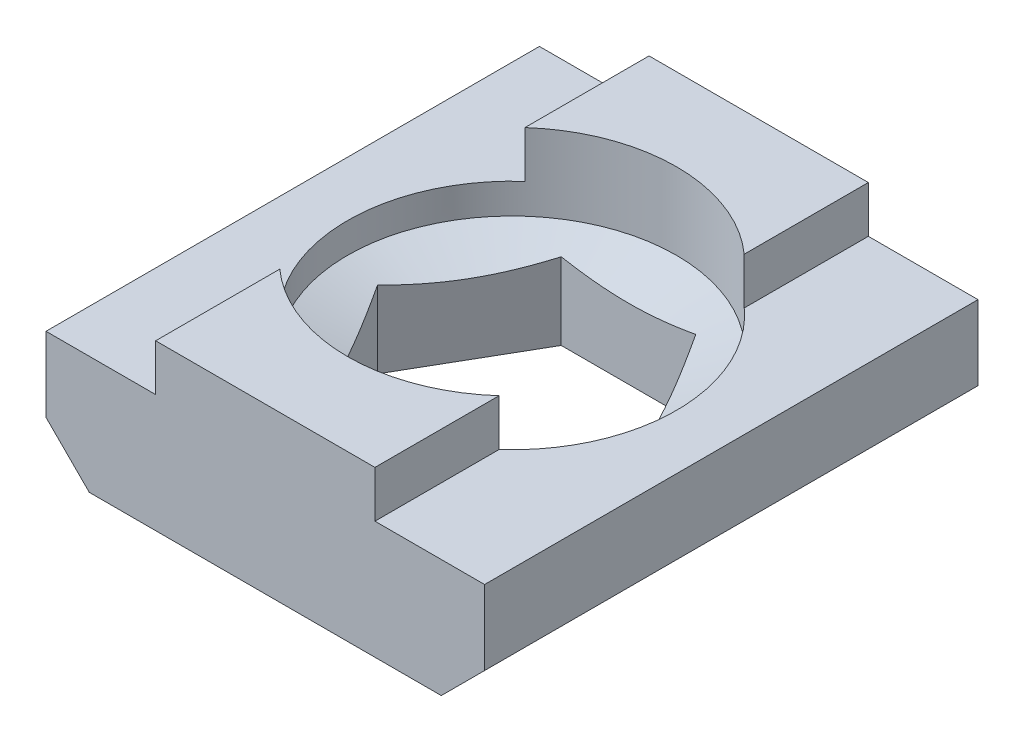
ISO-10303-21;
HEADER;
FILE_DESCRIPTION(('STEP AP214'),'2;1');
FILE_NAME('part.step','',(''),(''),'','','');
FILE_SCHEMA(('AUTOMOTIVE_DESIGN { 1 0 10303 214 1 1 1 1 }'));
ENDSEC;
DATA;
#1=APPLICATION_CONTEXT('core data for automotive mechanical design processes');
#2=APPLICATION_PROTOCOL_DEFINITION('international standard','automotive_design',2000,#1);
#3=PRODUCT_CONTEXT('',#1,'mechanical');
#4=PRODUCT('Part','Part','',(#3));
#5=PRODUCT_RELATED_PRODUCT_CATEGORY('part','',(#4));
#6=PRODUCT_DEFINITION_FORMATION('','',#4);
#7=PRODUCT_DEFINITION_CONTEXT('part definition',#1,'design');
#8=PRODUCT_DEFINITION('design','',#6,#7);
#9=PRODUCT_DEFINITION_SHAPE('','',#8);
#10=(LENGTH_UNIT() NAMED_UNIT(*) SI_UNIT(.MILLI.,.METRE.));
#11=(NAMED_UNIT(*) PLANE_ANGLE_UNIT() SI_UNIT($,.RADIAN.));
#12=(NAMED_UNIT(*) SI_UNIT($,.STERADIAN.) SOLID_ANGLE_UNIT());
#13=UNCERTAINTY_MEASURE_WITH_UNIT(LENGTH_MEASURE(1.E-05),#10,'distance_accuracy_value','');
#14=(GEOMETRIC_REPRESENTATION_CONTEXT(3) GLOBAL_UNCERTAINTY_ASSIGNED_CONTEXT((#13)) GLOBAL_UNIT_ASSIGNED_CONTEXT((#10,
#11,#12)) REPRESENTATION_CONTEXT('',''));
#15=CARTESIAN_POINT('',(0.,0.,0.));
#16=DIRECTION('',(0.,0.,1.));
#17=DIRECTION('',(1.,0.,0.));
#18=AXIS2_PLACEMENT_3D('',#15,#16,#17);
#19=CARTESIAN_POINT('',(4.,3.,9.));
#20=DIRECTION('',(0.,-1.,0.));
#21=DIRECTION('',(0.,0.,-1.));
#22=AXIS2_PLACEMENT_3D('',#19,#20,#21);
#23=PLANE('',#22);
#24=DIRECTION('',(0.,0.,1.));
#25=VECTOR('',#24,1.);
#26=CARTESIAN_POINT('',(4.,3.,9.));
#27=LINE('',#26,#25);
#28=CARTESIAN_POINT('',(4.,3.,4.47213595499958));
#29=VERTEX_POINT('',#28);
#30=CARTESIAN_POINT('',(4.,3.,9.));
#31=VERTEX_POINT('',#30);
#32=EDGE_CURVE('E273',#29,#31,#27,.T.);
#33=ORIENTED_EDGE('',*,*,#32,.F.);
#34=CARTESIAN_POINT('',(0.,3.,0.));
#35=DIRECTION('',(0.,1.,0.));
#36=DIRECTION('',(0.,0.,1.));
#37=AXIS2_PLACEMENT_3D('',#34,#35,#36);
#38=CIRCLE('',#37,6.);
#39=CARTESIAN_POINT('',(-4.,3.,4.47213595499958));
#40=VERTEX_POINT('',#39);
#41=EDGE_CURVE('E197',#40,#29,#38,.T.);
#42=ORIENTED_EDGE('',*,*,#41,.F.);
#43=DIRECTION('',(0.,0.,1.));
#44=VECTOR('',#43,1.);
#45=CARTESIAN_POINT('',(-4.,3.,9.));
#46=LINE('',#45,#44);
#47=CARTESIAN_POINT('',(-4.,3.,9.));
#48=VERTEX_POINT('',#47);
#49=EDGE_CURVE('E290',#40,#48,#46,.T.);
#50=ORIENTED_EDGE('',*,*,#49,.T.);
#51=DIRECTION('',(-1.,0.,0.));
#52=VECTOR('',#51,1.);
#53=CARTESIAN_POINT('',(4.,3.,9.));
#54=LINE('',#53,#52);
#55=EDGE_CURVE('E298',#31,#48,#54,.T.);
#56=ORIENTED_EDGE('',*,*,#55,.F.);
#57=EDGE_LOOP('',(#33,#42,#50,#56));
#58=FACE_BOUND('',#57,.T.);
#59=ADVANCED_FACE('F33',(#58),#23,.F.);
#60=CARTESIAN_POINT('',(4.,0.,0.));
#61=DIRECTION('',(1.,0.,0.));
#62=DIRECTION('',(0.,0.,-1.));
#63=AXIS2_PLACEMENT_3D('',#60,#61,#62);
#64=PLANE('',#63);
#65=DIRECTION('',(0.,1.,0.));
#66=VECTOR('',#65,1.);
#67=CARTESIAN_POINT('',(4.,1.,-4.47213595499958));
#68=LINE('',#67,#66);
#69=CARTESIAN_POINT('',(4.,1.3,-4.47213595499958));
#70=VERTEX_POINT('',#69);
#71=CARTESIAN_POINT('',(4.,3.,-4.47213595499958));
#72=VERTEX_POINT('',#71);
#73=EDGE_CURVE('E203',#70,#72,#68,.T.);
#74=ORIENTED_EDGE('',*,*,#73,.F.);
#75=DIRECTION('',(0.,0.,1.));
#76=VECTOR('',#75,1.);
#77=CARTESIAN_POINT('',(4.,1.3,-9.));
#78=LINE('',#77,#76);
#79=CARTESIAN_POINT('',(4.,1.3,-9.));
#80=VERTEX_POINT('',#79);
#81=EDGE_CURVE('E231',#80,#70,#78,.T.);
#82=ORIENTED_EDGE('',*,*,#81,.F.);
#83=DIRECTION('',(0.,1.,0.));
#84=VECTOR('',#83,1.);
#85=CARTESIAN_POINT('',(4.,3.,-9.));
#86=LINE('',#85,#84);
#87=CARTESIAN_POINT('',(4.,3.,-9.));
#88=VERTEX_POINT('',#87);
#89=EDGE_CURVE('E272',#80,#88,#86,.T.);
#90=ORIENTED_EDGE('',*,*,#89,.T.);
#91=EDGE_CURVE('E279',#88,#72,#27,.T.);
#92=ORIENTED_EDGE('',*,*,#91,.T.);
#93=EDGE_LOOP('',(#74,#82,#90,#92));
#94=FACE_BOUND('',#93,.T.);
#95=ADVANCED_FACE('F362',(#94),#64,.T.);
#96=CARTESIAN_POINT('',(-4.,0.,0.));
#97=DIRECTION('',(1.,0.,0.));
#98=DIRECTION('',(0.,0.,-1.));
#99=AXIS2_PLACEMENT_3D('',#96,#97,#98);
#100=PLANE('',#99);
#101=DIRECTION('',(0.,0.,1.));
#102=VECTOR('',#101,1.);
#103=CARTESIAN_POINT('',(-4.,1.3,-9.));
#104=LINE('',#103,#102);
#105=CARTESIAN_POINT('',(-4.,1.3,-9.));
#106=VERTEX_POINT('',#105);
#107=CARTESIAN_POINT('',(-4.,1.3,-4.47213595499958));
#108=VERTEX_POINT('',#107);
#109=EDGE_CURVE('E249',#106,#108,#104,.T.);
#110=ORIENTED_EDGE('',*,*,#109,.T.);
#111=DIRECTION('',(0.,1.,0.));
#112=VECTOR('',#111,1.);
#113=CARTESIAN_POINT('',(-4.,1.,-4.47213595499958));
#114=LINE('',#113,#112);
#115=CARTESIAN_POINT('',(-4.,3.,-4.47213595499958));
#116=VERTEX_POINT('',#115);
#117=EDGE_CURVE('E210',#108,#116,#114,.T.);
#118=ORIENTED_EDGE('',*,*,#117,.T.);
#119=CARTESIAN_POINT('',(-4.,3.,-9.));
#120=VERTEX_POINT('',#119);
#121=EDGE_CURVE('E284',#120,#116,#46,.T.);
#122=ORIENTED_EDGE('',*,*,#121,.F.);
#123=DIRECTION('',(0.,1.,0.));
#124=VECTOR('',#123,1.);
#125=CARTESIAN_POINT('',(-4.,3.,-9.));
#126=LINE('',#125,#124);
#127=EDGE_CURVE('E287',#106,#120,#126,.T.);
#128=ORIENTED_EDGE('',*,*,#127,.F.);
#129=EDGE_LOOP('',(#110,#118,#122,#128));
#130=FACE_BOUND('',#129,.T.);
#131=ADVANCED_FACE('F321',(#130),#100,.F.);
#132=CARTESIAN_POINT('',(4.,3.,-9.));
#133=DIRECTION('',(0.,0.,1.));
#134=DIRECTION('',(0.,-1.,0.));
#135=AXIS2_PLACEMENT_3D('',#132,#133,#134);
#136=PLANE('',#135);
#137=DIRECTION('',(-1.,0.,0.));
#138=VECTOR('',#137,1.);
#139=CARTESIAN_POINT('',(4.,-3.,-9.));
#140=LINE('',#139,#138);
#141=CARTESIAN_POINT('',(6.42,-3.,-9.));
#142=VERTEX_POINT('',#141);
#143=CARTESIAN_POINT('',(-6.42,-3.,-9.));
#144=VERTEX_POINT('',#143);
#145=EDGE_CURVE('E278',#142,#144,#140,.T.);
#146=ORIENTED_EDGE('',*,*,#145,.T.);
#147=DIRECTION('',(0.707106781186546,-0.707106781186549,0.));
#148=VECTOR('',#147,1.);
#149=CARTESIAN_POINT('',(-6.42,-3.,-9.));
#150=LINE('',#149,#148);
#151=CARTESIAN_POINT('',(-8.,-1.41999999999999,-9.));
#152=VERTEX_POINT('',#151);
#153=EDGE_CURVE('E250',#152,#144,#150,.T.);
#154=ORIENTED_EDGE('',*,*,#153,.F.);
#155=DIRECTION('',(0.,-1.,0.));
#156=VECTOR('',#155,1.);
#157=CARTESIAN_POINT('',(-8.,-1.41999999999999,-9.));
#158=LINE('',#157,#156);
#159=CARTESIAN_POINT('',(-8.,1.3,-9.));
#160=VERTEX_POINT('',#159);
#161=EDGE_CURVE('E268',#160,#152,#158,.T.);
#162=ORIENTED_EDGE('',*,*,#161,.F.);
#163=DIRECTION('',(-1.,0.,0.));
#164=VECTOR('',#163,1.);
#165=CARTESIAN_POINT('',(-4.,1.3,-9.));
#166=LINE('',#165,#164);
#167=EDGE_CURVE('E265',#106,#160,#166,.T.);
#168=ORIENTED_EDGE('',*,*,#167,.F.);
#169=ORIENTED_EDGE('',*,*,#127,.T.);
#170=DIRECTION('',(-1.,0.,0.));
#171=VECTOR('',#170,1.);
#172=CARTESIAN_POINT('',(4.,3.,-9.));
#173=LINE('',#172,#171);
#174=EDGE_CURVE('E246',#88,#120,#173,.T.);
#175=ORIENTED_EDGE('',*,*,#174,.F.);
#176=ORIENTED_EDGE('',*,*,#89,.F.);
#177=DIRECTION('',(-1.,0.,0.));
#178=VECTOR('',#177,1.);
#179=CARTESIAN_POINT('',(4.,1.3,-9.));
#180=LINE('',#179,#178);
#181=CARTESIAN_POINT('',(8.,1.3,-9.));
#182=VERTEX_POINT('',#181);
#183=EDGE_CURVE('E221',#182,#80,#180,.T.);
#184=ORIENTED_EDGE('',*,*,#183,.F.);
#185=DIRECTION('',(0.,1.,0.));
#186=VECTOR('',#185,1.);
#187=CARTESIAN_POINT('',(8.,-1.41999999999999,-9.));
#188=LINE('',#187,#186);
#189=CARTESIAN_POINT('',(8.,-1.41999999999999,-9.));
#190=VERTEX_POINT('',#189);
#191=EDGE_CURVE('E217',#190,#182,#188,.T.);
#192=ORIENTED_EDGE('',*,*,#191,.F.);
#193=DIRECTION('',(0.707106781186546,0.707106781186549,0.));
#194=VECTOR('',#193,1.);
#195=CARTESIAN_POINT('',(6.42,-3.,-9.));
#196=LINE('',#195,#194);
#197=EDGE_CURVE('E214',#142,#190,#196,.T.);
#198=ORIENTED_EDGE('',*,*,#197,.F.);
#199=EDGE_LOOP('',(#146,#154,#162,#168,#169,#175,#176,#184,#192,#198));
#200=FACE_BOUND('',#199,.T.);
#201=ADVANCED_FACE('F35',(#200),#136,.F.);
#202=ORIENTED_EDGE('',*,*,#121,.T.);
#203=EDGE_CURVE('E199',#72,#116,#38,.T.);
#204=ORIENTED_EDGE('',*,*,#203,.F.);
#205=ORIENTED_EDGE('',*,*,#91,.F.);
#206=ORIENTED_EDGE('',*,*,#174,.T.);
#207=EDGE_LOOP('',(#202,#204,#205,#206));
#208=FACE_BOUND('',#207,.T.);
#209=ADVANCED_FACE('F309',(#208),#23,.F.);
#210=CARTESIAN_POINT('',(4.,3.,9.));
#211=DIRECTION('',(0.,0.,-1.));
#212=DIRECTION('',(0.,1.,0.));
#213=AXIS2_PLACEMENT_3D('',#210,#211,#212);
#214=PLANE('',#213);
#215=DIRECTION('',(0.,-1.,0.));
#216=VECTOR('',#215,1.);
#217=CARTESIAN_POINT('',(-4.,3.,9.));
#218=LINE('',#217,#216);
#219=CARTESIAN_POINT('',(-4.,1.3,9.));
#220=VERTEX_POINT('',#219);
#221=EDGE_CURVE('E274',#48,#220,#218,.T.);
#222=ORIENTED_EDGE('',*,*,#221,.T.);
#223=DIRECTION('',(-1.,0.,0.));
#224=VECTOR('',#223,1.);
#225=CARTESIAN_POINT('',(-4.,1.3,9.));
#226=LINE('',#225,#224);
#227=CARTESIAN_POINT('',(-8.,1.3,9.));
#228=VERTEX_POINT('',#227);
#229=EDGE_CURVE('E230',#220,#228,#226,.T.);
#230=ORIENTED_EDGE('',*,*,#229,.T.);
#231=DIRECTION('',(0.,-1.,0.));
#232=VECTOR('',#231,1.);
#233=CARTESIAN_POINT('',(-8.,-1.41999999999999,9.));
#234=LINE('',#233,#232);
#235=CARTESIAN_POINT('',(-8.,-1.41999999999999,9.));
#236=VERTEX_POINT('',#235);
#237=EDGE_CURVE('E335',#228,#236,#234,.T.);
#238=ORIENTED_EDGE('',*,*,#237,.T.);
#239=DIRECTION('',(0.707106781186546,-0.707106781186549,0.));
#240=VECTOR('',#239,1.);
#241=CARTESIAN_POINT('',(-6.42,-3.,9.));
#242=LINE('',#241,#240);
#243=CARTESIAN_POINT('',(-6.42,-3.,9.));
#244=VERTEX_POINT('',#243);
#245=EDGE_CURVE('E269',#236,#244,#242,.T.);
#246=ORIENTED_EDGE('',*,*,#245,.T.);
#247=DIRECTION('',(-1.,0.,0.));
#248=VECTOR('',#247,1.);
#249=CARTESIAN_POINT('',(4.,-3.,9.));
#250=LINE('',#249,#248);
#251=CARTESIAN_POINT('',(6.42,-3.,9.));
#252=VERTEX_POINT('',#251);
#253=EDGE_CURVE('E297',#252,#244,#250,.T.);
#254=ORIENTED_EDGE('',*,*,#253,.F.);
#255=DIRECTION('',(0.707106781186546,0.707106781186549,0.));
#256=VECTOR('',#255,1.);
#257=CARTESIAN_POINT('',(6.42,-3.,9.));
#258=LINE('',#257,#256);
#259=CARTESIAN_POINT('',(8.,-1.41999999999999,9.));
#260=VERTEX_POINT('',#259);
#261=EDGE_CURVE('E213',#252,#260,#258,.T.);
#262=ORIENTED_EDGE('',*,*,#261,.T.);
#263=DIRECTION('',(0.,1.,0.));
#264=VECTOR('',#263,1.);
#265=CARTESIAN_POINT('',(8.,-1.41999999999999,9.));
#266=LINE('',#265,#264);
#267=CARTESIAN_POINT('',(8.,1.3,9.));
#268=VERTEX_POINT('',#267);
#269=EDGE_CURVE('E224',#260,#268,#266,.T.);
#270=ORIENTED_EDGE('',*,*,#269,.T.);
#271=DIRECTION('',(-1.,0.,0.));
#272=VECTOR('',#271,1.);
#273=CARTESIAN_POINT('',(4.,1.3,9.));
#274=LINE('',#273,#272);
#275=CARTESIAN_POINT('',(4.,1.3,9.));
#276=VERTEX_POINT('',#275);
#277=EDGE_CURVE('E218',#268,#276,#274,.T.);
#278=ORIENTED_EDGE('',*,*,#277,.T.);
#279=DIRECTION('',(0.,-1.,0.));
#280=VECTOR('',#279,1.);
#281=CARTESIAN_POINT('',(4.,3.,9.));
#282=LINE('',#281,#280);
#283=EDGE_CURVE('E275',#31,#276,#282,.T.);
#284=ORIENTED_EDGE('',*,*,#283,.F.);
#285=ORIENTED_EDGE('',*,*,#55,.T.);
#286=EDGE_LOOP('',(#222,#230,#238,#246,#254,#262,#270,#278,#284,#285));
#287=FACE_BOUND('',#286,.T.);
#288=ADVANCED_FACE('F331',(#287),#214,.F.);
#289=CARTESIAN_POINT('',(4.,-3.,9.));
#290=DIRECTION('',(0.,1.,0.));
#291=DIRECTION('',(0.,0.,1.));
#292=AXIS2_PLACEMENT_3D('',#289,#290,#291);
#293=PLANE('',#292);
#294=DIRECTION('',(-0.5,0.,-0.866025403784439));
#295=VECTOR('',#294,1.);
#296=CARTESIAN_POINT('',(-2.45373864405591,-3.,4.25));
#297=LINE('',#296,#295);
#298=CARTESIAN_POINT('',(-2.45373864405591,-3.,4.25));
#299=VERTEX_POINT('',#298);
#300=CARTESIAN_POINT('',(-4.90747728811182,-3.,0.));
#301=VERTEX_POINT('',#300);
#302=EDGE_CURVE('E188',#299,#301,#297,.T.);
#303=ORIENTED_EDGE('',*,*,#302,.F.);
#304=DIRECTION('',(-1.,0.,0.));
#305=VECTOR('',#304,1.);
#306=CARTESIAN_POINT('',(2.45373864405591,-3.,4.25));
#307=LINE('',#306,#305);
#308=CARTESIAN_POINT('',(2.45373864405591,-3.,4.25));
#309=VERTEX_POINT('',#308);
#310=EDGE_CURVE('E445',#309,#299,#307,.T.);
#311=ORIENTED_EDGE('',*,*,#310,.F.);
#312=DIRECTION('',(-0.5,0.,0.866025403784439));
#313=VECTOR('',#312,1.);
#314=CARTESIAN_POINT('',(4.90747728811182,-3.,0.));
#315=LINE('',#314,#313);
#316=CARTESIAN_POINT('',(4.90747728811182,-3.,0.));
#317=VERTEX_POINT('',#316);
#318=EDGE_CURVE('E193',#317,#309,#315,.T.);
#319=ORIENTED_EDGE('',*,*,#318,.F.);
#320=DIRECTION('',(0.5,0.,0.866025403784439));
#321=VECTOR('',#320,1.);
#322=CARTESIAN_POINT('',(2.45373864405591,-3.,-4.25));
#323=LINE('',#322,#321);
#324=CARTESIAN_POINT('',(2.45373864405591,-3.,-4.25));
#325=VERTEX_POINT('',#324);
#326=EDGE_CURVE('E645',#325,#317,#323,.T.);
#327=ORIENTED_EDGE('',*,*,#326,.F.);
#328=DIRECTION('',(1.,0.,0.));
#329=VECTOR('',#328,1.);
#330=CARTESIAN_POINT('',(-2.45373864405591,-3.,-4.25));
#331=LINE('',#330,#329);
#332=CARTESIAN_POINT('',(-2.45373864405591,-3.,-4.25));
#333=VERTEX_POINT('',#332);
#334=EDGE_CURVE('E647',#333,#325,#331,.T.);
#335=ORIENTED_EDGE('',*,*,#334,.F.);
#336=DIRECTION('',(0.5,0.,-0.866025403784439));
#337=VECTOR('',#336,1.);
#338=CARTESIAN_POINT('',(-4.90747728811182,-3.,0.));
#339=LINE('',#338,#337);
#340=EDGE_CURVE('E648',#301,#333,#339,.T.);
#341=ORIENTED_EDGE('',*,*,#340,.F.);
#342=EDGE_LOOP('',(#303,#311,#319,#327,#335,#341));
#343=FACE_BOUND('',#342,.T.);
#344=ORIENTED_EDGE('',*,*,#253,.T.);
#345=DIRECTION('',(0.,0.,1.));
#346=VECTOR('',#345,1.);
#347=CARTESIAN_POINT('',(-6.42,-3.,-9.));
#348=LINE('',#347,#346);
#349=EDGE_CURVE('E291',#144,#244,#348,.T.);
#350=ORIENTED_EDGE('',*,*,#349,.F.);
#351=ORIENTED_EDGE('',*,*,#145,.F.);
#352=DIRECTION('',(0.,0.,1.));
#353=VECTOR('',#352,1.);
#354=CARTESIAN_POINT('',(6.42,-3.,-9.));
#355=LINE('',#354,#353);
#356=EDGE_CURVE('E227',#142,#252,#355,.T.);
#357=ORIENTED_EDGE('',*,*,#356,.T.);
#358=EDGE_LOOP('',(#344,#350,#351,#357));
#359=FACE_BOUND('',#358,.T.);
#360=ADVANCED_FACE('F377',(#343,#359),#293,.F.);
#361=DIRECTION('',(0.,1.,0.));
#362=VECTOR('',#361,1.);
#363=CARTESIAN_POINT('',(4.,1.,4.47213595499958));
#364=LINE('',#363,#362);
#365=CARTESIAN_POINT('',(4.,1.3,4.47213595499958));
#366=VERTEX_POINT('',#365);
#367=EDGE_CURVE('E201',#29,#366,#364,.F.);
#368=ORIENTED_EDGE('',*,*,#367,.F.);
#369=ORIENTED_EDGE('',*,*,#32,.T.);
#370=ORIENTED_EDGE('',*,*,#283,.T.);
#371=EDGE_CURVE('E241',#366,#276,#78,.T.);
#372=ORIENTED_EDGE('',*,*,#371,.F.);
#373=EDGE_LOOP('',(#368,#369,#370,#372));
#374=FACE_BOUND('',#373,.T.);
#375=ADVANCED_FACE('F369',(#374),#64,.T.);
#376=ORIENTED_EDGE('',*,*,#49,.F.);
#377=DIRECTION('',(0.,1.,0.));
#378=VECTOR('',#377,1.);
#379=CARTESIAN_POINT('',(-4.,1.,4.47213595499958));
#380=LINE('',#379,#378);
#381=CARTESIAN_POINT('',(-4.,1.3,4.47213595499958));
#382=VERTEX_POINT('',#381);
#383=EDGE_CURVE('E207',#40,#382,#380,.F.);
#384=ORIENTED_EDGE('',*,*,#383,.T.);
#385=EDGE_CURVE('E247',#382,#220,#104,.T.);
#386=ORIENTED_EDGE('',*,*,#385,.T.);
#387=ORIENTED_EDGE('',*,*,#221,.F.);
#388=EDGE_LOOP('',(#376,#384,#386,#387));
#389=FACE_BOUND('',#388,.T.);
#390=ADVANCED_FACE('F327',(#389),#100,.F.);
#391=CARTESIAN_POINT('',(-6.42,-3.,-9.));
#392=DIRECTION('',(-0.707106781186549,-0.707106781186546,0.));
#393=DIRECTION('',(0.707106781186546,-0.707106781186549,0.));
#394=AXIS2_PLACEMENT_3D('',#391,#392,#393);
#395=PLANE('',#394);
#396=ORIENTED_EDGE('',*,*,#245,.F.);
#397=DIRECTION('',(0.,0.,1.));
#398=VECTOR('',#397,1.);
#399=CARTESIAN_POINT('',(-8.,-1.41999999999999,-9.));
#400=LINE('',#399,#398);
#401=EDGE_CURVE('E344',#152,#236,#400,.T.);
#402=ORIENTED_EDGE('',*,*,#401,.F.);
#403=ORIENTED_EDGE('',*,*,#153,.T.);
#404=ORIENTED_EDGE('',*,*,#349,.T.);
#405=EDGE_LOOP('',(#396,#402,#403,#404));
#406=FACE_BOUND('',#405,.T.);
#407=ADVANCED_FACE('F351',(#406),#395,.T.);
#408=CARTESIAN_POINT('',(-8.,-1.41999999999999,-9.));
#409=DIRECTION('',(-1.,0.,0.));
#410=DIRECTION('',(0.,0.,1.));
#411=AXIS2_PLACEMENT_3D('',#408,#409,#410);
#412=PLANE('',#411);
#413=ORIENTED_EDGE('',*,*,#237,.F.);
#414=DIRECTION('',(0.,0.,1.));
#415=VECTOR('',#414,1.);
#416=CARTESIAN_POINT('',(-8.,1.3,-9.));
#417=LINE('',#416,#415);
#418=EDGE_CURVE('E254',#160,#228,#417,.T.);
#419=ORIENTED_EDGE('',*,*,#418,.F.);
#420=ORIENTED_EDGE('',*,*,#161,.T.);
#421=ORIENTED_EDGE('',*,*,#401,.T.);
#422=EDGE_LOOP('',(#413,#419,#420,#421));
#423=FACE_BOUND('',#422,.T.);
#424=ADVANCED_FACE('F349',(#423),#412,.T.);
#425=CARTESIAN_POINT('',(-4.,1.3,-9.));
#426=DIRECTION('',(0.,1.,0.));
#427=DIRECTION('',(-1.,0.,0.));
#428=AXIS2_PLACEMENT_3D('',#425,#426,#427);
#429=PLANE('',#428);
#430=CARTESIAN_POINT('',(0.,1.3,0.));
#431=DIRECTION('',(0.,1.,0.));
#432=DIRECTION('',(-1.,0.,0.));
#433=AXIS2_PLACEMENT_3D('',#430,#431,#432);
#434=CIRCLE('',#433,6.);
#435=EDGE_CURVE('E205',#108,#382,#434,.T.);
#436=ORIENTED_EDGE('',*,*,#435,.F.);
#437=ORIENTED_EDGE('',*,*,#109,.F.);
#438=ORIENTED_EDGE('',*,*,#167,.T.);
#439=ORIENTED_EDGE('',*,*,#418,.T.);
#440=ORIENTED_EDGE('',*,*,#229,.F.);
#441=ORIENTED_EDGE('',*,*,#385,.F.);
#442=EDGE_LOOP('',(#436,#437,#438,#439,#440,#441));
#443=FACE_BOUND('',#442,.T.);
#444=ADVANCED_FACE('F348',(#443),#429,.T.);
#445=CARTESIAN_POINT('',(6.42,-3.,-9.));
#446=DIRECTION('',(0.707106781186549,-0.707106781186546,0.));
#447=DIRECTION('',(0.707106781186546,0.707106781186549,0.));
#448=AXIS2_PLACEMENT_3D('',#445,#446,#447);
#449=PLANE('',#448);
#450=ORIENTED_EDGE('',*,*,#261,.F.);
#451=ORIENTED_EDGE('',*,*,#356,.F.);
#452=ORIENTED_EDGE('',*,*,#197,.T.);
#453=DIRECTION('',(0.,0.,1.));
#454=VECTOR('',#453,1.);
#455=CARTESIAN_POINT('',(8.,-1.41999999999999,-9.));
#456=LINE('',#455,#454);
#457=EDGE_CURVE('E405',#190,#260,#456,.T.);
#458=ORIENTED_EDGE('',*,*,#457,.T.);
#459=EDGE_LOOP('',(#450,#451,#452,#458));
#460=FACE_BOUND('',#459,.T.);
#461=ADVANCED_FACE('F357',(#460),#449,.T.);
#462=CARTESIAN_POINT('',(4.,1.3,-9.));
#463=DIRECTION('',(0.,1.,0.));
#464=DIRECTION('',(-1.,0.,0.));
#465=AXIS2_PLACEMENT_3D('',#462,#463,#464);
#466=PLANE('',#465);
#467=CARTESIAN_POINT('',(0.,1.3,0.));
#468=DIRECTION('',(0.,1.,0.));
#469=DIRECTION('',(-1.,0.,0.));
#470=AXIS2_PLACEMENT_3D('',#467,#468,#469);
#471=CIRCLE('',#470,6.);
#472=EDGE_CURVE('E46',#366,#70,#471,.T.);
#473=ORIENTED_EDGE('',*,*,#472,.F.);
#474=ORIENTED_EDGE('',*,*,#371,.T.);
#475=ORIENTED_EDGE('',*,*,#277,.F.);
#476=DIRECTION('',(0.,0.,1.));
#477=VECTOR('',#476,1.);
#478=CARTESIAN_POINT('',(8.,1.3,-9.));
#479=LINE('',#478,#477);
#480=EDGE_CURVE('E234',#182,#268,#479,.T.);
#481=ORIENTED_EDGE('',*,*,#480,.F.);
#482=ORIENTED_EDGE('',*,*,#183,.T.);
#483=ORIENTED_EDGE('',*,*,#81,.T.);
#484=EDGE_LOOP('',(#473,#474,#475,#481,#482,#483));
#485=FACE_BOUND('',#484,.T.);
#486=ADVANCED_FACE('F402',(#485),#466,.T.);
#487=CARTESIAN_POINT('',(8.,-1.41999999999999,-9.));
#488=DIRECTION('',(1.,0.,0.));
#489=DIRECTION('',(0.,0.,-1.));
#490=AXIS2_PLACEMENT_3D('',#487,#488,#489);
#491=PLANE('',#490);
#492=ORIENTED_EDGE('',*,*,#269,.F.);
#493=ORIENTED_EDGE('',*,*,#457,.F.);
#494=ORIENTED_EDGE('',*,*,#191,.T.);
#495=ORIENTED_EDGE('',*,*,#480,.T.);
#496=EDGE_LOOP('',(#492,#493,#494,#495));
#497=FACE_BOUND('',#496,.T.);
#498=ADVANCED_FACE('F412',(#497),#491,.T.);
#499=CARTESIAN_POINT('',(0.,1.,0.));
#500=DIRECTION('',(0.,1.,0.));
#501=DIRECTION('',(0.,0.,1.));
#502=AXIS2_PLACEMENT_3D('',#499,#500,#501);
#503=CYLINDRICAL_SURFACE('',#502,6.);
#504=ORIENTED_EDGE('',*,*,#435,.T.);
#505=ORIENTED_EDGE('',*,*,#383,.F.);
#506=ORIENTED_EDGE('',*,*,#41,.T.);
#507=ORIENTED_EDGE('',*,*,#367,.T.);
#508=ORIENTED_EDGE('',*,*,#472,.T.);
#509=ORIENTED_EDGE('',*,*,#73,.T.);
#510=ORIENTED_EDGE('',*,*,#203,.T.);
#511=ORIENTED_EDGE('',*,*,#117,.F.);
#512=EDGE_LOOP('',(#504,#505,#506,#507,#508,#509,#510,#511));
#513=FACE_BOUND('',#512,.T.);
#514=CARTESIAN_POINT('',(0.,0.200000000000001,0.));
#515=DIRECTION('',(0.,-1.,0.));
#516=DIRECTION('',(0.,0.,-1.));
#517=AXIS2_PLACEMENT_3D('',#514,#515,#516);
#518=CIRCLE('',#517,6.);
#519=CARTESIAN_POINT('',(0.,0.200000000000001,-6.));
#520=VERTEX_POINT('',#519);
#521=EDGE_CURVE('E184',#520,#520,#518,.T.);
#522=ORIENTED_EDGE('',*,*,#521,.T.);
#523=EDGE_LOOP('',(#522));
#524=FACE_BOUND('',#523,.T.);
#525=ADVANCED_FACE('F428',(#513,#524),#503,.F.);
#526=CARTESIAN_POINT('',(2.45373864405591,3.000025,4.25));
#527=DIRECTION('',(0.,0.,1.));
#528=DIRECTION('',(1.,0.,0.));
#529=AXIS2_PLACEMENT_3D('',#526,#527,#528);
#530=PLANE('',#529);
#531=DIRECTION('',(0.,-1.,0.));
#532=VECTOR('',#531,1.);
#533=CARTESIAN_POINT('',(-2.45373864405591,3.000025,4.25));
#534=LINE('',#533,#532);
#535=CARTESIAN_POINT('',(-2.45373864405591,-0.197645747387084,4.25));
#536=VERTEX_POINT('',#535);
#537=EDGE_CURVE('E59',#536,#299,#534,.T.);
#538=ORIENTED_EDGE('',*,*,#537,.F.);
#539=CARTESIAN_POINT('',(-6.51436184154452,0.847188823738504,4.25));
#540=CARTESIAN_POINT('',(-6.32185392453019,0.788522368236173,4.25));
#541=CARTESIAN_POINT('',(-6.12913470732467,0.730536681694376,4.25));
#542=CARTESIAN_POINT('',(-5.74316602338794,0.616303495409457,4.25));
#543=CARTESIAN_POINT('',(-5.5499165163478,0.560056132023769,4.25));
#544=CARTESIAN_POINT('',(-5.1624543620528,0.449584228118926,4.25));
#545=CARTESIAN_POINT('',(-4.96824059793102,0.395363590802965,4.25));
#546=CARTESIAN_POINT('',(-4.57909290971289,0.289575105302536,4.25));
#547=CARTESIAN_POINT('',(-4.38415899851191,0.23800720986091,4.25));
#548=CARTESIAN_POINT('',(-3.99589168640154,0.138807714990011,4.25));
#549=CARTESIAN_POINT('',(-3.80256887947181,0.0911348549377696,4.25));
#550=CARTESIAN_POINT('',(-3.41497312933515,-0.000176401972228466,4.25));
#551=CARTESIAN_POINT('',(-3.22070021825775,-0.0438149342784774,4.25));
#552=CARTESIAN_POINT('',(-2.83114168825223,-0.126050227351096,4.25));
#553=CARTESIAN_POINT('',(-2.63585638875951,-0.164648488451173,4.25));
#554=CARTESIAN_POINT('',(-2.24415132855499,-0.235631551406893,4.25));
#555=CARTESIAN_POINT('',(-2.0477316055948,-0.268016558815259,4.25));
#556=CARTESIAN_POINT('',(-1.67582437183872,-0.322059821473952,4.25));
#557=CARTESIAN_POINT('',(-1.50045343101238,-0.344512796157686,4.25));
#558=CARTESIAN_POINT('',(-1.1489744338244,-0.382579170322766,4.25));
#559=CARTESIAN_POINT('',(-0.972866441067907,-0.398193148182443,4.25));
#560=CARTESIAN_POINT('',(-0.620257720399248,-0.421832119906658,4.25));
#561=CARTESIAN_POINT('',(-0.44375735481892,-0.429862431710971,4.25));
#562=CARTESIAN_POINT('',(-0.0905721111476933,-0.437926685442383,4.25));
#563=CARTESIAN_POINT('',(0.0861127655537268,-0.437960687158347,4.25));
#564=CARTESIAN_POINT('',(0.440232194200711,-0.430009418736151,4.25));
#565=CARTESIAN_POINT('',(0.617665779812646,-0.42198181360387,4.25));
#566=CARTESIAN_POINT('',(0.972016565843205,-0.398273986316361,4.25));
#567=CARTESIAN_POINT('',(1.14893375358062,-0.382593577795143,4.25));
#568=CARTESIAN_POINT('',(1.50216453325804,-0.344317415975948,4.25));
#569=CARTESIAN_POINT('',(1.67847745995481,-0.321715611355691,4.25));
#570=CARTESIAN_POINT('',(2.0302205676042,-0.270518953493557,4.25));
#571=CARTESIAN_POINT('',(2.20565074591162,-0.241924082304049,4.25));
#572=CARTESIAN_POINT('',(2.57156965992484,-0.176838392499482,4.25));
#573=CARTESIAN_POINT('',(2.76197187101366,-0.139865183407493,4.25));
#574=CARTESIAN_POINT('',(3.14176365338498,-0.0610093667274228,4.25));
#575=CARTESIAN_POINT('',(3.33115313786311,-0.0191263451374171,4.25));
#576=CARTESIAN_POINT('',(3.7090626449337,0.0686109600643328,4.25));
#577=CARTESIAN_POINT('',(3.8975823967446,0.11446640273569,4.25));
#578=CARTESIAN_POINT('',(4.2738184192108,0.209372914279168,4.25));
#579=CARTESIAN_POINT('',(4.46153466078027,0.258424097806956,4.25));
#580=CARTESIAN_POINT('',(5.02416262645897,0.409548051894105,4.25));
#581=CARTESIAN_POINT('',(5.39803910193005,0.51546798068569,4.25));
#582=CARTESIAN_POINT('',(6.14372537133292,0.734022943177978,4.25));
#583=CARTESIAN_POINT('',(6.51553551854874,0.846656787798189,4.25));
#584=CARTESIAN_POINT('',(7.25330763539582,1.07517332658107,4.25));
#585=CARTESIAN_POINT('',(7.61928656487585,1.19100144607297,4.25));
#586=CARTESIAN_POINT('',(8.35023499097926,1.42585411280437,4.25));
#587=CARTESIAN_POINT('',(8.715204432742,1.5448788301396,4.25));
#588=CARTESIAN_POINT('',(9.44290955617929,1.78476027489914,4.25));
#589=CARTESIAN_POINT('',(9.80564831398259,1.90560769220574,4.25));
#590=CARTESIAN_POINT('',(10.5305058059089,2.14904619025833,4.25));
#591=CARTESIAN_POINT('',(10.8926245909811,2.27163711917403,4.25));
#592=CARTESIAN_POINT('',(11.2545343032014,2.39483343118178,4.25));
#593=B_SPLINE_CURVE_WITH_KNOTS('',3,(#539,#540,#541,#542,#543,#544,#545,#546,#547,#548,#549,
#550,#551,#552,#553,#554,#555,#556,#557,#558,#559,#560,#561,#562,#563,#564,#565,#566,#567,#568,
#569,#570,#571,#572,#573,#574,#575,#576,#577,#578,#579,#580,#581,#582,#583,#584,#585,#586,#587,
#588,#589,#590,#591,#592),.UNSPECIFIED.,.F.,.F.,(4,2,2,2,2,2,2,2,2,2,2,2,2,2,2,2,2,2,2,2,2,2,2,
2,2,2,4),(0.,0.603750426485387,1.20754809273279,1.81245424926815,2.41734962599393,
3.01465764514095,3.61194560298411,4.20905535930361,4.80614535806677,5.33643672043176,
5.86668322705431,6.39655762902802,6.92642806910059,7.45909571573821,7.99177633488832,
8.52492400861707,9.05807327900324,9.63986888728399,10.22171358868,10.8037286342729,
11.3857645727085,12.5514229584146,13.7168755079111,14.8684663897626,16.0201186713639,
17.167132249953,18.3140465473872),.UNSPECIFIED.);
#594=CARTESIAN_POINT('',(2.45373864405591,-0.197645747387084,4.25));
#595=VERTEX_POINT('',#594);
#596=EDGE_CURVE('E53',#536,#595,#593,.T.);
#597=ORIENTED_EDGE('',*,*,#596,.T.);
#598=DIRECTION('',(0.,-1.,0.));
#599=VECTOR('',#598,1.);
#600=CARTESIAN_POINT('',(2.45373864405591,3.000025,4.25));
#601=LINE('',#600,#599);
#602=EDGE_CURVE('E200',#595,#309,#601,.T.);
#603=ORIENTED_EDGE('',*,*,#602,.T.);
#604=ORIENTED_EDGE('',*,*,#310,.T.);
#605=EDGE_LOOP('',(#538,#597,#603,#604));
#606=FACE_BOUND('',#605,.T.);
#607=ADVANCED_FACE('F432',(#606),#530,.F.);
#608=CARTESIAN_POINT('',(4.90747728811182,3.000025,0.));
#609=DIRECTION('',(0.866025403784439,0.,0.5));
#610=DIRECTION('',(0.5,0.,-0.866025403784439));
#611=AXIS2_PLACEMENT_3D('',#608,#609,#610);
#612=PLANE('',#611);
#613=ORIENTED_EDGE('',*,*,#602,.F.);
#614=CARTESIAN_POINT('',(2.45362317400207,-0.197603718241244,4.2502));
#615=CARTESIAN_POINT('',(2.55524739097648,-0.234606674923836,4.07418169292092));
#616=CARTESIAN_POINT('',(2.65720673272343,-0.268267339050109,3.89758293270893));
#617=CARTESIAN_POINT('',(2.86178840252829,-0.327488156709816,3.54323708630963));
#618=CARTESIAN_POINT('',(2.96441118572057,-0.353041970765523,3.36548921180647));
#619=CARTESIAN_POINT('',(3.16918079656847,-0.394374564254043,3.0108178419718));
#620=CARTESIAN_POINT('',(3.2713229472077,-0.410243501262065,2.8339024474703));
#621=CARTESIAN_POINT('',(3.47584612326901,-0.431528214060303,2.47965791520676));
#622=CARTESIAN_POINT('',(3.57822704467644,-0.436947909965848,2.30232895760338));
#623=CARTESIAN_POINT('',(3.78298888749129,-0.436947909965848,1.94767104239662));
#624=CARTESIAN_POINT('',(3.88536980889872,-0.431528214060304,1.77034208479324));
#625=CARTESIAN_POINT('',(4.08989298496003,-0.410243501262065,1.4160975525297));
#626=CARTESIAN_POINT('',(4.19203513559926,-0.394374564254043,1.2391821580282));
#627=CARTESIAN_POINT('',(4.39680474644716,-0.353041970765523,0.884510788193525));
#628=CARTESIAN_POINT('',(4.49942752963944,-0.327488156709815,0.706762913690373));
#629=CARTESIAN_POINT('',(4.7040091994443,-0.268267339050109,0.352417067291071));
#630=CARTESIAN_POINT('',(4.80596854119125,-0.234606674923835,0.17581830707908));
#631=CARTESIAN_POINT('',(4.90759275816566,-0.197603718241243,-0.000200000000001044));
#632=B_SPLINE_CURVE_WITH_KNOTS('',3,(#614,#615,#616,#617,#618,#619,#620,#621,#622,#623,#624,
#625,#626,#627,#628,#629,#630,#631),.UNSPECIFIED.,.F.,.F.,(4,2,2,2,2,2,2,2,4),(0.,
0.619831881067383,1.24014727664084,1.85459631785523,2.46881479877022,3.08303327968522,
3.69748232089961,4.31779771647306,4.93762959754044),.UNSPECIFIED.);
#633=CARTESIAN_POINT('',(4.90747728811182,-0.197645747387084,0.));
#634=VERTEX_POINT('',#633);
#635=EDGE_CURVE('E446',#595,#634,#632,.T.);
#636=ORIENTED_EDGE('',*,*,#635,.T.);
#637=DIRECTION('',(0.,-1.,0.));
#638=VECTOR('',#637,1.);
#639=CARTESIAN_POINT('',(4.90747728811182,3.000025,0.));
#640=LINE('',#639,#638);
#641=EDGE_CURVE('E636',#634,#317,#640,.T.);
#642=ORIENTED_EDGE('',*,*,#641,.T.);
#643=ORIENTED_EDGE('',*,*,#318,.T.);
#644=EDGE_LOOP('',(#613,#636,#642,#643));
#645=FACE_BOUND('',#644,.T.);
#646=ADVANCED_FACE('F435',(#645),#612,.F.);
#647=CARTESIAN_POINT('',(2.45373864405591,3.000025,-4.25));
#648=DIRECTION('',(0.866025403784439,0.,-0.5));
#649=DIRECTION('',(-0.5,0.,-0.866025403784439));
#650=AXIS2_PLACEMENT_3D('',#647,#648,#649);
#651=PLANE('',#650);
#652=ORIENTED_EDGE('',*,*,#641,.F.);
#653=CARTESIAN_POINT('',(4.90759275816566,-0.197603718241243,0.000199999999999173));
#654=CARTESIAN_POINT('',(4.80596854119125,-0.234606674923835,-0.175818307079081));
#655=CARTESIAN_POINT('',(4.7040091994443,-0.268267339050109,-0.352417067291072));
#656=CARTESIAN_POINT('',(4.49942752963944,-0.327488156709815,-0.706762913690374));
#657=CARTESIAN_POINT('',(4.39680474644716,-0.353041970765522,-0.884510788193526));
#658=CARTESIAN_POINT('',(4.19203513559926,-0.394374564254042,-1.2391821580282));
#659=CARTESIAN_POINT('',(4.08989298496003,-0.410243501262064,-1.4160975525297));
#660=CARTESIAN_POINT('',(3.88536980889872,-0.431528214060303,-1.77034208479324));
#661=CARTESIAN_POINT('',(3.78298888749129,-0.436947909965848,-1.94767104239662));
#662=CARTESIAN_POINT('',(3.57822704467644,-0.436947909965848,-2.30232895760338));
#663=CARTESIAN_POINT('',(3.47584612326901,-0.431528214060303,-2.47965791520676));
#664=CARTESIAN_POINT('',(3.2713229472077,-0.410243501262065,-2.8339024474703));
#665=CARTESIAN_POINT('',(3.16918079656847,-0.394374564254043,-3.0108178419718));
#666=CARTESIAN_POINT('',(2.96441118572057,-0.353041970765523,-3.36548921180647));
#667=CARTESIAN_POINT('',(2.86178840252829,-0.327488156709816,-3.54323708630962));
#668=CARTESIAN_POINT('',(2.65720673272343,-0.268267339050109,-3.89758293270893));
#669=CARTESIAN_POINT('',(2.55524739097648,-0.234606674923836,-4.07418169292092));
#670=CARTESIAN_POINT('',(2.45362317400207,-0.197603718241244,-4.2502));
#671=B_SPLINE_CURVE_WITH_KNOTS('',3,(#653,#654,#655,#656,#657,#658,#659,#660,#661,#662,#663,
#664,#665,#666,#667,#668,#669,#670),.UNSPECIFIED.,.F.,.F.,(4,2,2,2,2,2,2,2,4),(0.,
0.619831881067382,1.24014727664083,1.85459631785522,2.46881479877022,3.08303327968521,
3.6974823208996,4.31779771647305,4.93762959754044),.UNSPECIFIED.);
#672=CARTESIAN_POINT('',(2.45373864405591,-0.197645747387084,-4.25));
#673=VERTEX_POINT('',#672);
#674=EDGE_CURVE('E472',#634,#673,#671,.T.);
#675=ORIENTED_EDGE('',*,*,#674,.T.);
#676=DIRECTION('',(0.,-1.,0.));
#677=VECTOR('',#676,1.);
#678=CARTESIAN_POINT('',(2.45373864405591,3.000025,-4.25));
#679=LINE('',#678,#677);
#680=EDGE_CURVE('E191',#673,#325,#679,.T.);
#681=ORIENTED_EDGE('',*,*,#680,.T.);
#682=ORIENTED_EDGE('',*,*,#326,.T.);
#683=EDGE_LOOP('',(#652,#675,#681,#682));
#684=FACE_BOUND('',#683,.T.);
#685=ADVANCED_FACE('F477',(#684),#651,.F.);
#686=CARTESIAN_POINT('',(-2.45373864405591,3.000025,-4.25));
#687=DIRECTION('',(0.,0.,-1.));
#688=DIRECTION('',(-1.,0.,0.));
#689=AXIS2_PLACEMENT_3D('',#686,#687,#688);
#690=PLANE('',#689);
#691=ORIENTED_EDGE('',*,*,#680,.F.);
#692=CARTESIAN_POINT('',(-6.51436184154452,0.847188823738504,-4.25));
#693=CARTESIAN_POINT('',(-6.32185392453019,0.788522368236173,-4.25));
#694=CARTESIAN_POINT('',(-6.12913470732467,0.730536681694376,-4.25));
#695=CARTESIAN_POINT('',(-5.74316602338794,0.616303495409457,-4.25));
#696=CARTESIAN_POINT('',(-5.5499165163478,0.560056132023769,-4.25));
#697=CARTESIAN_POINT('',(-5.16245436205279,0.449584228118926,-4.25));
#698=CARTESIAN_POINT('',(-4.96824059793102,0.395363590802965,-4.25));
#699=CARTESIAN_POINT('',(-4.57909290971288,0.289575105302536,-4.25));
#700=CARTESIAN_POINT('',(-4.3841589985119,0.23800720986091,-4.25));
#701=CARTESIAN_POINT('',(-3.99589168640154,0.138807714990011,-4.25));
#702=CARTESIAN_POINT('',(-3.80256887947181,0.0911348549377691,-4.25));
#703=CARTESIAN_POINT('',(-3.41497312933515,-0.000176401972228994,-4.25));
#704=CARTESIAN_POINT('',(-3.22070021825775,-0.0438149342784778,-4.25));
#705=CARTESIAN_POINT('',(-2.83114168825223,-0.126050227351096,-4.25));
#706=CARTESIAN_POINT('',(-2.63585638875951,-0.164648488451174,-4.25));
#707=CARTESIAN_POINT('',(-2.24415132855499,-0.235631551406893,-4.25));
#708=CARTESIAN_POINT('',(-2.0477316055948,-0.268016558815259,-4.25));
#709=CARTESIAN_POINT('',(-1.67582437183872,-0.322059821473952,-4.25));
#710=CARTESIAN_POINT('',(-1.50045343101238,-0.344512796157686,-4.25));
#711=CARTESIAN_POINT('',(-1.1489744338244,-0.382579170322766,-4.25));
#712=CARTESIAN_POINT('',(-0.972866441067906,-0.398193148182443,-4.25));
#713=CARTESIAN_POINT('',(-0.620257720399247,-0.421832119906659,-4.25));
#714=CARTESIAN_POINT('',(-0.443757354818918,-0.429862431710971,-4.25));
#715=CARTESIAN_POINT('',(-0.0905721111476911,-0.437926685442383,-4.25));
#716=CARTESIAN_POINT('',(0.0861127655537293,-0.437960687158347,-4.25));
#717=CARTESIAN_POINT('',(0.440232194200714,-0.430009418736151,-4.25));
#718=CARTESIAN_POINT('',(0.617665779812648,-0.42198181360387,-4.25));
#719=CARTESIAN_POINT('',(0.972016565843208,-0.398273986316361,-4.25));
#720=CARTESIAN_POINT('',(1.14893375358062,-0.382593577795142,-4.25));
#721=CARTESIAN_POINT('',(1.50216453325805,-0.344317415975948,-4.25));
#722=CARTESIAN_POINT('',(1.67847745995481,-0.321715611355691,-4.25));
#723=CARTESIAN_POINT('',(2.0302205676042,-0.270518953493556,-4.25));
#724=CARTESIAN_POINT('',(2.20565074591162,-0.241924082304048,-4.25));
#725=CARTESIAN_POINT('',(2.57156965992484,-0.176838392499482,-4.25));
#726=CARTESIAN_POINT('',(2.76197187101367,-0.139865183407493,-4.25));
#727=CARTESIAN_POINT('',(3.14176365338498,-0.0610093667274228,-4.25));
#728=CARTESIAN_POINT('',(3.33115313786311,-0.0191263451374169,-4.25));
#729=CARTESIAN_POINT('',(3.7090626449337,0.0686109600643331,-4.25));
#730=CARTESIAN_POINT('',(3.8975823967446,0.11446640273569,-4.25));
#731=CARTESIAN_POINT('',(4.2738184192108,0.209372914279168,-4.25));
#732=CARTESIAN_POINT('',(4.46153466078028,0.258424097806957,-4.25));
#733=CARTESIAN_POINT('',(5.02416262645898,0.409548051894106,-4.25));
#734=CARTESIAN_POINT('',(5.39803910193005,0.515467980685691,-4.25));
#735=CARTESIAN_POINT('',(6.14372537133292,0.734022943177978,-4.25));
#736=CARTESIAN_POINT('',(6.51553551854874,0.846656787798189,-4.25));
#737=CARTESIAN_POINT('',(7.25330763539582,1.07517332658107,-4.25));
#738=CARTESIAN_POINT('',(7.61928656487585,1.19100144607297,-4.25));
#739=CARTESIAN_POINT('',(8.35023499097926,1.42585411280437,-4.25));
#740=CARTESIAN_POINT('',(8.715204432742,1.5448788301396,-4.25));
#741=CARTESIAN_POINT('',(9.44290955617929,1.78476027489914,-4.25));
#742=CARTESIAN_POINT('',(9.80564831398259,1.90560769220574,-4.25));
#743=CARTESIAN_POINT('',(10.5305058059089,2.14904619025833,-4.25));
#744=CARTESIAN_POINT('',(10.8926245909811,2.27163711917403,-4.25));
#745=CARTESIAN_POINT('',(11.2545343032015,2.39483343118178,-4.25));
#746=B_SPLINE_CURVE_WITH_KNOTS('',3,(#692,#693,#694,#695,#696,#697,#698,#699,#700,#701,#702,
#703,#704,#705,#706,#707,#708,#709,#710,#711,#712,#713,#714,#715,#716,#717,#718,#719,#720,#721,
#722,#723,#724,#725,#726,#727,#728,#729,#730,#731,#732,#733,#734,#735,#736,#737,#738,#739,#740,
#741,#742,#743,#744,#745),.UNSPECIFIED.,.F.,.F.,(4,2,2,2,2,2,2,2,2,2,2,2,2,2,2,2,2,2,2,2,2,2,2,
2,2,2,4),(0.,0.603750426485386,1.20754809273279,1.81245424926815,2.41734962599393,
3.01465764514095,3.61194560298411,4.20905535930361,4.80614535806677,5.33643672043176,
5.86668322705431,6.39655762902802,6.92642806910059,7.45909571573821,7.99177633488832,
8.52492400861707,9.05807327900324,9.639868887284,10.22171358868,10.8037286342729,
11.3857645727085,12.5514229584146,13.7168755079111,14.8684663897626,16.0201186713639,
17.167132249953,18.3140465473872),.UNSPECIFIED.);
#747=CARTESIAN_POINT('',(-2.45373864405591,-0.197645747387084,-4.25));
#748=VERTEX_POINT('',#747);
#749=EDGE_CURVE('E183',#673,#748,#746,.F.);
#750=ORIENTED_EDGE('',*,*,#749,.T.);
#751=DIRECTION('',(0.,-1.,0.));
#752=VECTOR('',#751,1.);
#753=CARTESIAN_POINT('',(-2.45373864405591,3.000025,-4.25));
#754=LINE('',#753,#752);
#755=EDGE_CURVE('E182',#748,#333,#754,.T.);
#756=ORIENTED_EDGE('',*,*,#755,.T.);
#757=ORIENTED_EDGE('',*,*,#334,.T.);
#758=EDGE_LOOP('',(#691,#750,#756,#757));
#759=FACE_BOUND('',#758,.T.);
#760=ADVANCED_FACE('F480',(#759),#690,.F.);
#761=CARTESIAN_POINT('',(-4.90747728811182,3.000025,0.));
#762=DIRECTION('',(-0.866025403784439,0.,-0.5));
#763=DIRECTION('',(-0.5,0.,0.866025403784439));
#764=AXIS2_PLACEMENT_3D('',#761,#762,#763);
#765=PLANE('',#764);
#766=ORIENTED_EDGE('',*,*,#755,.F.);
#767=CARTESIAN_POINT('',(-2.45362317400207,-0.197603718241244,-4.2502));
#768=CARTESIAN_POINT('',(-2.55524739097648,-0.234606674923835,-4.07418169292092));
#769=CARTESIAN_POINT('',(-2.65720673272343,-0.268267339050109,-3.89758293270893));
#770=CARTESIAN_POINT('',(-2.86178840252829,-0.327488156709815,-3.54323708630963));
#771=CARTESIAN_POINT('',(-2.96441118572057,-0.353041970765523,-3.36548921180647));
#772=CARTESIAN_POINT('',(-3.16918079656847,-0.394374564254042,-3.0108178419718));
#773=CARTESIAN_POINT('',(-3.2713229472077,-0.410243501262064,-2.8339024474703));
#774=CARTESIAN_POINT('',(-3.47584612326901,-0.431528214060303,-2.47965791520676));
#775=CARTESIAN_POINT('',(-3.57822704467644,-0.436947909965848,-2.30232895760338));
#776=CARTESIAN_POINT('',(-3.78298888749129,-0.436947909965848,-1.94767104239662));
#777=CARTESIAN_POINT('',(-3.88536980889872,-0.431528214060303,-1.77034208479324));
#778=CARTESIAN_POINT('',(-4.08989298496003,-0.410243501262064,-1.4160975525297));
#779=CARTESIAN_POINT('',(-4.19203513559926,-0.394374564254042,-1.2391821580282));
#780=CARTESIAN_POINT('',(-4.39680474644716,-0.353041970765522,-0.884510788193527));
#781=CARTESIAN_POINT('',(-4.49942752963944,-0.327488156709815,-0.706762913690375));
#782=CARTESIAN_POINT('',(-4.7040091994443,-0.268267339050109,-0.352417067291073));
#783=CARTESIAN_POINT('',(-4.80596854119125,-0.234606674923835,-0.175818307079081));
#784=CARTESIAN_POINT('',(-4.90759275816566,-0.197603718241243,0.000199999999999951));
#785=B_SPLINE_CURVE_WITH_KNOTS('',3,(#767,#768,#769,#770,#771,#772,#773,#774,#775,#776,#777,
#778,#779,#780,#781,#782,#783,#784),.UNSPECIFIED.,.F.,.F.,(4,2,2,2,2,2,2,2,4),(0.,
0.619831881067382,1.24014727664083,1.85459631785522,2.46881479877022,3.08303327968521,
3.69748232089961,4.31779771647306,4.93762959754044),.UNSPECIFIED.);
#786=CARTESIAN_POINT('',(-4.90747728811182,-0.197645747387084,0.));
#787=VERTEX_POINT('',#786);
#788=EDGE_CURVE('E174',#748,#787,#785,.T.);
#789=ORIENTED_EDGE('',*,*,#788,.T.);
#790=DIRECTION('',(0.,-1.,0.));
#791=VECTOR('',#790,1.);
#792=CARTESIAN_POINT('',(-4.90747728811182,3.000025,0.));
#793=LINE('',#792,#791);
#794=EDGE_CURVE('E181',#787,#301,#793,.T.);
#795=ORIENTED_EDGE('',*,*,#794,.T.);
#796=ORIENTED_EDGE('',*,*,#340,.T.);
#797=EDGE_LOOP('',(#766,#789,#795,#796));
#798=FACE_BOUND('',#797,.T.);
#799=ADVANCED_FACE('F179',(#798),#765,.F.);
#800=CARTESIAN_POINT('',(-2.45373864405591,3.000025,4.25));
#801=DIRECTION('',(-0.866025403784439,0.,0.5));
#802=DIRECTION('',(0.5,0.,0.866025403784439));
#803=AXIS2_PLACEMENT_3D('',#800,#801,#802);
#804=PLANE('',#803);
#805=ORIENTED_EDGE('',*,*,#794,.F.);
#806=CARTESIAN_POINT('',(-4.90759275816566,-0.197603718241243,-0.000200000000000156));
#807=CARTESIAN_POINT('',(-4.80596854119125,-0.234606674923835,0.17581830707908));
#808=CARTESIAN_POINT('',(-4.7040091994443,-0.268267339050108,0.352417067291071));
#809=CARTESIAN_POINT('',(-4.49942752963944,-0.327488156709815,0.706762913690373));
#810=CARTESIAN_POINT('',(-4.39680474644716,-0.353041970765522,0.884510788193526));
#811=CARTESIAN_POINT('',(-4.19203513559926,-0.394374564254042,1.2391821580282));
#812=CARTESIAN_POINT('',(-4.08989298496003,-0.410243501262064,1.4160975525297));
#813=CARTESIAN_POINT('',(-3.88536980889872,-0.431528214060303,1.77034208479324));
#814=CARTESIAN_POINT('',(-3.78298888749129,-0.436947909965847,1.94767104239662));
#815=CARTESIAN_POINT('',(-3.57822704467644,-0.436947909965847,2.30232895760338));
#816=CARTESIAN_POINT('',(-3.47584612326901,-0.431528214060303,2.47965791520676));
#817=CARTESIAN_POINT('',(-3.2713229472077,-0.410243501262064,2.8339024474703));
#818=CARTESIAN_POINT('',(-3.16918079656847,-0.394374564254042,3.0108178419718));
#819=CARTESIAN_POINT('',(-2.96441118572057,-0.353041970765522,3.36548921180647));
#820=CARTESIAN_POINT('',(-2.86178840252829,-0.327488156709815,3.54323708630962));
#821=CARTESIAN_POINT('',(-2.65720673272343,-0.268267339050108,3.89758293270893));
#822=CARTESIAN_POINT('',(-2.55524739097648,-0.234606674923835,4.07418169292092));
#823=CARTESIAN_POINT('',(-2.45362317400207,-0.197603718241243,4.2502));
#824=B_SPLINE_CURVE_WITH_KNOTS('',3,(#806,#807,#808,#809,#810,#811,#812,#813,#814,#815,#816,
#817,#818,#819,#820,#821,#822,#823),.UNSPECIFIED.,.F.,.F.,(4,2,2,2,2,2,2,2,4),(0.,
0.619831881067382,1.24014727664083,1.85459631785522,2.46881479877022,3.08303327968521,
3.6974823208996,4.31779771647306,4.93762959754044),.UNSPECIFIED.);
#825=EDGE_CURVE('E11',#787,#536,#824,.T.);
#826=ORIENTED_EDGE('',*,*,#825,.T.);
#827=ORIENTED_EDGE('',*,*,#537,.T.);
#828=ORIENTED_EDGE('',*,*,#302,.T.);
#829=EDGE_LOOP('',(#805,#826,#827,#828));
#830=FACE_BOUND('',#829,.T.);
#831=ADVANCED_FACE('F186',(#830),#804,.F.);
#832=CARTESIAN_POINT('',(0.,-0.648685517197025,0.));
#833=DIRECTION('',(0.,1.,0.));
#834=DIRECTION('',(0.,0.,1.));
#835=AXIS2_PLACEMENT_3D('',#832,#833,#834);
#836=CONICAL_SURFACE('',#835,3.66825570528298,1.22173047639603);
#837=ORIENTED_EDGE('',*,*,#521,.F.);
#838=EDGE_LOOP('',(#837));
#839=FACE_BOUND('',#838,.T.);
#840=ORIENTED_EDGE('',*,*,#825,.F.);
#841=ORIENTED_EDGE('',*,*,#788,.F.);
#842=ORIENTED_EDGE('',*,*,#749,.F.);
#843=ORIENTED_EDGE('',*,*,#674,.F.);
#844=ORIENTED_EDGE('',*,*,#635,.F.);
#845=ORIENTED_EDGE('',*,*,#596,.F.);
#846=EDGE_LOOP('',(#840,#841,#842,#843,#844,#845));
#847=FACE_BOUND('',#846,.T.);
#848=ADVANCED_FACE('F173',(#839,#847),#836,.F.);
#849=CLOSED_SHELL('',(#59,#95,#131,#201,#209,#288,#360,#375,#390,#407,#424,#444,#461,#486,#498,
#525,#607,#646,#685,#760,#799,#831,#848));
#850=MANIFOLD_SOLID_BREP('B2',#849);
#851=ADVANCED_BREP_SHAPE_REPRESENTATION('',(#18,#850),#14);
#852=SHAPE_DEFINITION_REPRESENTATION(#9,#851);
ENDSEC;
END-ISO-10303-21;
